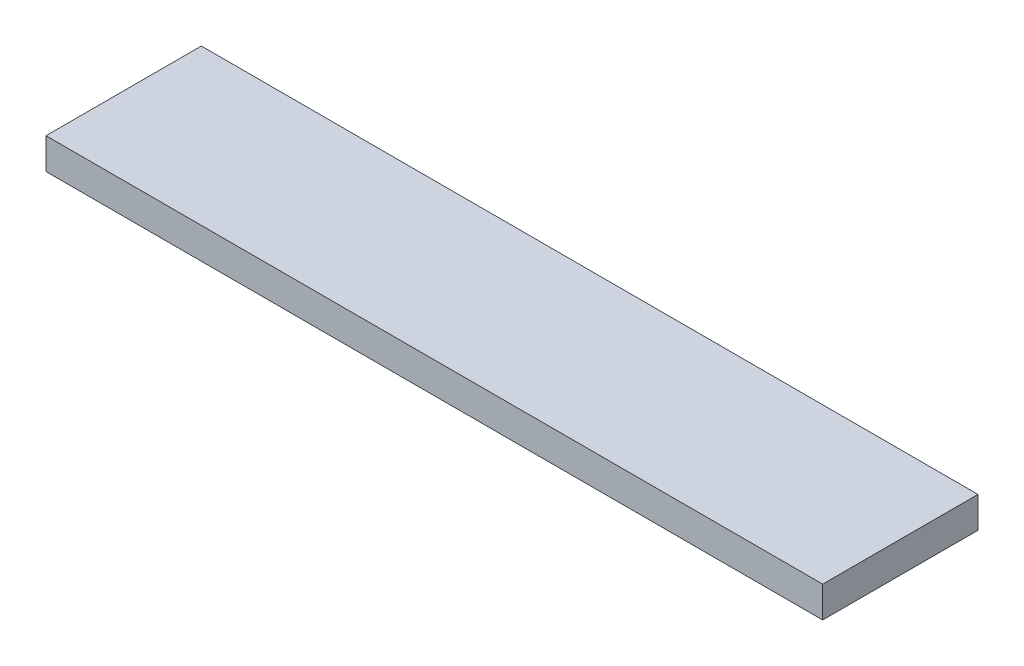
ISO-10303-21;
HEADER;
FILE_DESCRIPTION(('STEP AP214'),'2;1');
FILE_NAME('part.step','',(''),(''),'','','');
FILE_SCHEMA(('AUTOMOTIVE_DESIGN { 1 0 10303 214 1 1 1 1 }'));
ENDSEC;
DATA;
#1=APPLICATION_CONTEXT('core data for automotive mechanical design processes');
#2=APPLICATION_PROTOCOL_DEFINITION('international standard','automotive_design',2000,#1);
#3=PRODUCT_CONTEXT('',#1,'mechanical');
#4=PRODUCT('Part','Part','',(#3));
#5=PRODUCT_RELATED_PRODUCT_CATEGORY('part','',(#4));
#6=PRODUCT_DEFINITION_FORMATION('','',#4);
#7=PRODUCT_DEFINITION_CONTEXT('part definition',#1,'design');
#8=PRODUCT_DEFINITION('design','',#6,#7);
#9=PRODUCT_DEFINITION_SHAPE('','',#8);
#10=(LENGTH_UNIT() NAMED_UNIT(*) SI_UNIT(.MILLI.,.METRE.));
#11=(NAMED_UNIT(*) PLANE_ANGLE_UNIT() SI_UNIT($,.RADIAN.));
#12=(NAMED_UNIT(*) SI_UNIT($,.STERADIAN.) SOLID_ANGLE_UNIT());
#13=UNCERTAINTY_MEASURE_WITH_UNIT(LENGTH_MEASURE(1.E-05),#10,'distance_accuracy_value','');
#14=(GEOMETRIC_REPRESENTATION_CONTEXT(3) GLOBAL_UNCERTAINTY_ASSIGNED_CONTEXT((#13)) GLOBAL_UNIT_ASSIGNED_CONTEXT((#10,
#11,#12)) REPRESENTATION_CONTEXT('',''));
#15=CARTESIAN_POINT('',(0.,0.,0.));
#16=DIRECTION('',(0.,0.,1.));
#17=DIRECTION('',(1.,0.,0.));
#18=AXIS2_PLACEMENT_3D('',#15,#16,#17);
#19=CARTESIAN_POINT('',(0.,10.,0.));
#20=DIRECTION('',(1.,0.,0.));
#21=DIRECTION('',(0.,0.,-1.));
#22=AXIS2_PLACEMENT_3D('',#19,#20,#21);
#23=PLANE('',#22);
#24=DIRECTION('',(0.,0.,1.));
#25=VECTOR('',#24,1.);
#26=CARTESIAN_POINT('',(0.,0.,0.));
#27=LINE('',#26,#25);
#28=CARTESIAN_POINT('',(0.,0.,-50.));
#29=VERTEX_POINT('',#28);
#30=CARTESIAN_POINT('',(0.,0.,0.));
#31=VERTEX_POINT('',#30);
#32=EDGE_CURVE('E107',#29,#31,#27,.T.);
#33=ORIENTED_EDGE('',*,*,#32,.T.);
#34=DIRECTION('',(0.,-1.,0.));
#35=VECTOR('',#34,1.);
#36=CARTESIAN_POINT('',(0.,10.,0.));
#37=LINE('',#36,#35);
#38=CARTESIAN_POINT('',(0.,10.,0.));
#39=VERTEX_POINT('',#38);
#40=EDGE_CURVE('E11',#39,#31,#37,.T.);
#41=ORIENTED_EDGE('',*,*,#40,.F.);
#42=DIRECTION('',(0.,0.,1.));
#43=VECTOR('',#42,1.);
#44=CARTESIAN_POINT('',(0.,10.,0.));
#45=LINE('',#44,#43);
#46=CARTESIAN_POINT('',(0.,10.,-50.));
#47=VERTEX_POINT('',#46);
#48=EDGE_CURVE('E91',#47,#39,#45,.T.);
#49=ORIENTED_EDGE('',*,*,#48,.F.);
#50=DIRECTION('',(0.,-1.,0.));
#51=VECTOR('',#50,1.);
#52=CARTESIAN_POINT('',(0.,10.,-50.));
#53=LINE('',#52,#51);
#54=EDGE_CURVE('E103',#47,#29,#53,.T.);
#55=ORIENTED_EDGE('',*,*,#54,.T.);
#56=EDGE_LOOP('',(#33,#41,#49,#55));
#57=FACE_BOUND('',#56,.T.);
#58=ADVANCED_FACE('F39',(#57),#23,.F.);
#59=CARTESIAN_POINT('',(0.,10.,0.));
#60=DIRECTION('',(0.,0.,-1.));
#61=DIRECTION('',(-1.,0.,0.));
#62=AXIS2_PLACEMENT_3D('',#59,#60,#61);
#63=PLANE('',#62);
#64=DIRECTION('',(1.,0.,0.));
#65=VECTOR('',#64,1.);
#66=CARTESIAN_POINT('',(0.,0.,0.));
#67=LINE('',#66,#65);
#68=CARTESIAN_POINT('',(250.,0.,0.));
#69=VERTEX_POINT('',#68);
#70=EDGE_CURVE('E96',#31,#69,#67,.T.);
#71=ORIENTED_EDGE('',*,*,#70,.T.);
#72=DIRECTION('',(0.,-1.,0.));
#73=VECTOR('',#72,1.);
#74=CARTESIAN_POINT('',(250.,10.,0.));
#75=LINE('',#74,#73);
#76=CARTESIAN_POINT('',(250.,10.,0.));
#77=VERTEX_POINT('',#76);
#78=EDGE_CURVE('E48',#77,#69,#75,.T.);
#79=ORIENTED_EDGE('',*,*,#78,.F.);
#80=DIRECTION('',(1.,0.,0.));
#81=VECTOR('',#80,1.);
#82=CARTESIAN_POINT('',(0.,10.,0.));
#83=LINE('',#82,#81);
#84=EDGE_CURVE('E86',#39,#77,#83,.T.);
#85=ORIENTED_EDGE('',*,*,#84,.F.);
#86=ORIENTED_EDGE('',*,*,#40,.T.);
#87=EDGE_LOOP('',(#71,#79,#85,#86));
#88=FACE_BOUND('',#87,.T.);
#89=ADVANCED_FACE('F95',(#88),#63,.F.);
#90=CARTESIAN_POINT('',(250.,10.,0.));
#91=DIRECTION('',(-1.,0.,0.));
#92=DIRECTION('',(0.,0.,1.));
#93=AXIS2_PLACEMENT_3D('',#90,#91,#92);
#94=PLANE('',#93);
#95=DIRECTION('',(0.,0.,-1.));
#96=VECTOR('',#95,1.);
#97=CARTESIAN_POINT('',(250.,0.,0.));
#98=LINE('',#97,#96);
#99=CARTESIAN_POINT('',(250.,0.,-50.));
#100=VERTEX_POINT('',#99);
#101=EDGE_CURVE('E73',#69,#100,#98,.T.);
#102=ORIENTED_EDGE('',*,*,#101,.T.);
#103=DIRECTION('',(0.,-1.,0.));
#104=VECTOR('',#103,1.);
#105=CARTESIAN_POINT('',(250.,10.,-50.));
#106=LINE('',#105,#104);
#107=CARTESIAN_POINT('',(250.,10.,-50.));
#108=VERTEX_POINT('',#107);
#109=EDGE_CURVE('E98',#108,#100,#106,.T.);
#110=ORIENTED_EDGE('',*,*,#109,.F.);
#111=DIRECTION('',(0.,0.,-1.));
#112=VECTOR('',#111,1.);
#113=CARTESIAN_POINT('',(250.,10.,0.));
#114=LINE('',#113,#112);
#115=EDGE_CURVE('E89',#77,#108,#114,.T.);
#116=ORIENTED_EDGE('',*,*,#115,.F.);
#117=ORIENTED_EDGE('',*,*,#78,.T.);
#118=EDGE_LOOP('',(#102,#110,#116,#117));
#119=FACE_BOUND('',#118,.T.);
#120=ADVANCED_FACE('F99',(#119),#94,.F.);
#121=CARTESIAN_POINT('',(0.,10.,-50.));
#122=DIRECTION('',(0.,0.,1.));
#123=DIRECTION('',(1.,0.,0.));
#124=AXIS2_PLACEMENT_3D('',#121,#122,#123);
#125=PLANE('',#124);
#126=DIRECTION('',(-1.,0.,0.));
#127=VECTOR('',#126,1.);
#128=CARTESIAN_POINT('',(0.,0.,-50.));
#129=LINE('',#128,#127);
#130=EDGE_CURVE('E79',#100,#29,#129,.T.);
#131=ORIENTED_EDGE('',*,*,#130,.T.);
#132=ORIENTED_EDGE('',*,*,#54,.F.);
#133=DIRECTION('',(-1.,0.,0.));
#134=VECTOR('',#133,1.);
#135=CARTESIAN_POINT('',(0.,10.,-50.));
#136=LINE('',#135,#134);
#137=EDGE_CURVE('E56',#108,#47,#136,.T.);
#138=ORIENTED_EDGE('',*,*,#137,.F.);
#139=ORIENTED_EDGE('',*,*,#109,.T.);
#140=EDGE_LOOP('',(#131,#132,#138,#139));
#141=FACE_BOUND('',#140,.T.);
#142=ADVANCED_FACE('F120',(#141),#125,.F.);
#143=CARTESIAN_POINT('',(0.,10.,0.));
#144=DIRECTION('',(0.,-1.,0.));
#145=DIRECTION('',(0.,0.,-1.));
#146=AXIS2_PLACEMENT_3D('',#143,#144,#145);
#147=PLANE('',#146);
#148=ORIENTED_EDGE('',*,*,#48,.T.);
#149=ORIENTED_EDGE('',*,*,#84,.T.);
#150=ORIENTED_EDGE('',*,*,#115,.T.);
#151=ORIENTED_EDGE('',*,*,#137,.T.);
#152=EDGE_LOOP('',(#148,#149,#150,#151));
#153=FACE_BOUND('',#152,.T.);
#154=ADVANCED_FACE('F87',(#153),#147,.F.);
#155=CARTESIAN_POINT('',(0.,0.,0.));
#156=DIRECTION('',(0.,-1.,0.));
#157=DIRECTION('',(0.,0.,-1.));
#158=AXIS2_PLACEMENT_3D('',#155,#156,#157);
#159=PLANE('',#158);
#160=ORIENTED_EDGE('',*,*,#32,.F.);
#161=ORIENTED_EDGE('',*,*,#130,.F.);
#162=ORIENTED_EDGE('',*,*,#101,.F.);
#163=ORIENTED_EDGE('',*,*,#70,.F.);
#164=EDGE_LOOP('',(#160,#161,#162,#163));
#165=FACE_BOUND('',#164,.T.);
#166=ADVANCED_FACE('F123',(#165),#159,.T.);
#167=CLOSED_SHELL('',(#58,#89,#120,#142,#154,#166));
#168=MANIFOLD_SOLID_BREP('B2',#167);
#169=ADVANCED_BREP_SHAPE_REPRESENTATION('',(#18,#168),#14);
#170=SHAPE_DEFINITION_REPRESENTATION(#9,#169);
ENDSEC;
END-ISO-10303-21;
